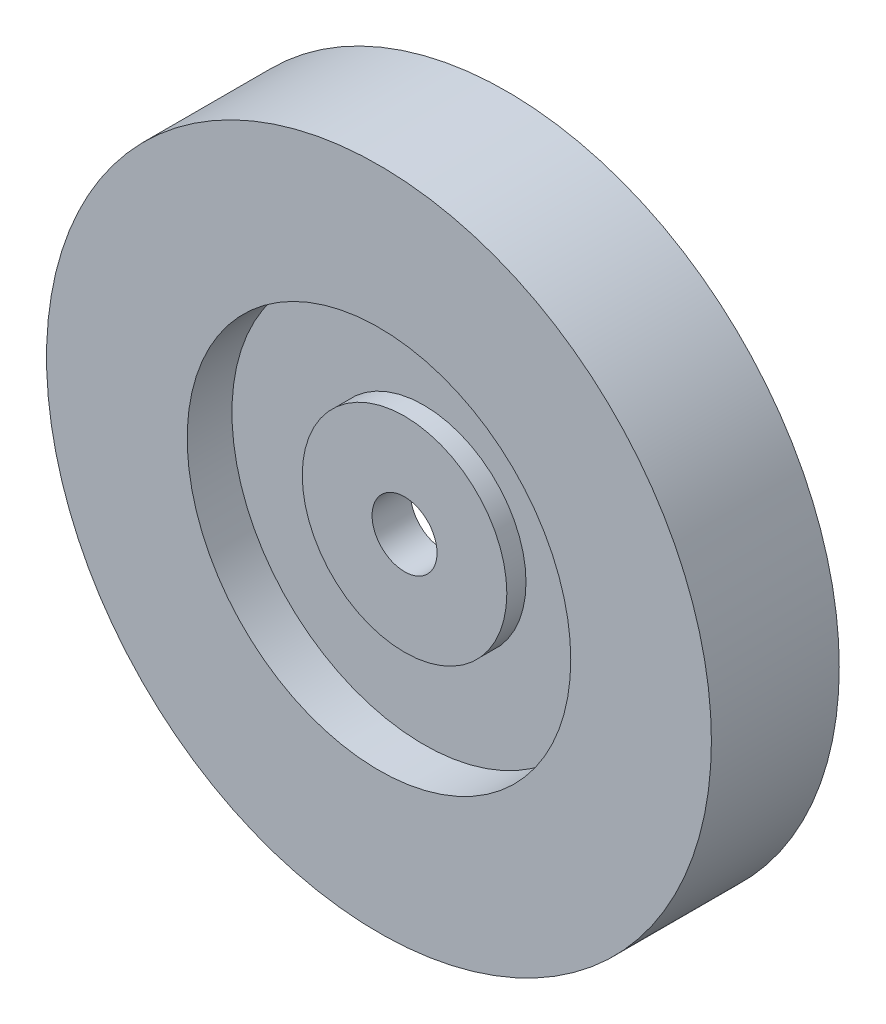
ISO-10303-21;
HEADER;
FILE_DESCRIPTION(('STEP AP214'),'2;1');
FILE_NAME('part.step','',(''),(''),'','','');
FILE_SCHEMA(('AUTOMOTIVE_DESIGN { 1 0 10303 214 1 1 1 1 }'));
ENDSEC;
DATA;
#1=APPLICATION_CONTEXT('core data for automotive mechanical design processes');
#2=APPLICATION_PROTOCOL_DEFINITION('international standard','automotive_design',2000,#1);
#3=PRODUCT_CONTEXT('',#1,'mechanical');
#4=PRODUCT('Part','Part','',(#3));
#5=PRODUCT_RELATED_PRODUCT_CATEGORY('part','',(#4));
#6=PRODUCT_DEFINITION_FORMATION('','',#4);
#7=PRODUCT_DEFINITION_CONTEXT('part definition',#1,'design');
#8=PRODUCT_DEFINITION('design','',#6,#7);
#9=PRODUCT_DEFINITION_SHAPE('','',#8);
#10=(LENGTH_UNIT() NAMED_UNIT(*) SI_UNIT(.MILLI.,.METRE.));
#11=(NAMED_UNIT(*) PLANE_ANGLE_UNIT() SI_UNIT($,.RADIAN.));
#12=(NAMED_UNIT(*) SI_UNIT($,.STERADIAN.) SOLID_ANGLE_UNIT());
#13=UNCERTAINTY_MEASURE_WITH_UNIT(LENGTH_MEASURE(1.E-05),#10,'distance_accuracy_value','');
#14=(GEOMETRIC_REPRESENTATION_CONTEXT(3) GLOBAL_UNCERTAINTY_ASSIGNED_CONTEXT((#13)) GLOBAL_UNIT_ASSIGNED_CONTEXT((#10,
#11,#12)) REPRESENTATION_CONTEXT('',''));
#15=CARTESIAN_POINT('',(0.,0.,0.));
#16=DIRECTION('',(0.,0.,1.));
#17=DIRECTION('',(1.,0.,0.));
#18=AXIS2_PLACEMENT_3D('',#15,#16,#17);
#19=CARTESIAN_POINT('',(0.,0.,15.));
#20=DIRECTION('',(0.,0.,-1.));
#21=DIRECTION('',(-1.,0.,0.));
#22=AXIS2_PLACEMENT_3D('',#19,#20,#21);
#23=CYLINDRICAL_SURFACE('',#22,80.);
#24=CARTESIAN_POINT('',(0.,0.,-15.));
#25=DIRECTION('',(0.,0.,1.));
#26=DIRECTION('',(1.,0.,0.));
#27=AXIS2_PLACEMENT_3D('',#24,#25,#26);
#28=CIRCLE('',#27,80.);
#29=CARTESIAN_POINT('',(80.,0.,-15.));
#30=VERTEX_POINT('',#29);
#31=EDGE_CURVE('E127',#30,#30,#28,.T.);
#32=ORIENTED_EDGE('',*,*,#31,.F.);
#33=EDGE_LOOP('',(#32));
#34=FACE_BOUND('',#33,.T.);
#35=CARTESIAN_POINT('',(0.,0.,0.));
#36=DIRECTION('',(0.,0.,1.));
#37=DIRECTION('',(1.,0.,0.));
#38=AXIS2_PLACEMENT_3D('',#35,#36,#37);
#39=CIRCLE('',#38,80.);
#40=CARTESIAN_POINT('',(80.,0.,0.));
#41=VERTEX_POINT('',#40);
#42=EDGE_CURVE('E134',#41,#41,#39,.T.);
#43=ORIENTED_EDGE('',*,*,#42,.T.);
#44=EDGE_LOOP('',(#43));
#45=FACE_BOUND('',#44,.T.);
#46=ADVANCED_FACE('F39',(#34,#45),#23,.F.);
#47=CARTESIAN_POINT('',(0.,0.,50.));
#48=DIRECTION('',(0.,0.,-1.));
#49=DIRECTION('',(-1.,0.,0.));
#50=AXIS2_PLACEMENT_3D('',#47,#48,#49);
#51=CYLINDRICAL_SURFACE('',#50,150.);
#52=CARTESIAN_POINT('',(0.,0.,-50.));
#53=DIRECTION('',(0.,0.,1.));
#54=DIRECTION('',(1.,0.,0.));
#55=AXIS2_PLACEMENT_3D('',#52,#53,#54);
#56=CIRCLE('',#55,150.);
#57=CARTESIAN_POINT('',(150.,0.,-50.));
#58=VERTEX_POINT('',#57);
#59=EDGE_CURVE('E62',#58,#58,#56,.T.);
#60=ORIENTED_EDGE('',*,*,#59,.F.);
#61=EDGE_LOOP('',(#60));
#62=FACE_BOUND('',#61,.T.);
#63=CARTESIAN_POINT('',(0.,0.,-15.));
#64=DIRECTION('',(0.,0.,1.));
#65=DIRECTION('',(1.,0.,0.));
#66=AXIS2_PLACEMENT_3D('',#63,#64,#65);
#67=CIRCLE('',#66,150.);
#68=CARTESIAN_POINT('',(150.,0.,-15.));
#69=VERTEX_POINT('',#68);
#70=EDGE_CURVE('E132',#69,#69,#67,.T.);
#71=ORIENTED_EDGE('',*,*,#70,.T.);
#72=EDGE_LOOP('',(#71));
#73=FACE_BOUND('',#72,.T.);
#74=ADVANCED_FACE('F88',(#62,#73),#51,.F.);
#75=CARTESIAN_POINT('',(0.,0.,15.));
#76=DIRECTION('',(0.,0.,1.));
#77=DIRECTION('',(1.,0.,0.));
#78=AXIS2_PLACEMENT_3D('',#75,#76,#77);
#79=CIRCLE('',#78,150.);
#80=CARTESIAN_POINT('',(150.,0.,15.));
#81=VERTEX_POINT('',#80);
#82=EDGE_CURVE('E10',#81,#81,#79,.T.);
#83=ORIENTED_EDGE('',*,*,#82,.F.);
#84=EDGE_LOOP('',(#83));
#85=FACE_BOUND('',#84,.T.);
#86=CARTESIAN_POINT('',(0.,0.,50.));
#87=DIRECTION('',(0.,0.,1.));
#88=DIRECTION('',(1.,0.,0.));
#89=AXIS2_PLACEMENT_3D('',#86,#87,#88);
#90=CIRCLE('',#89,150.);
#91=CARTESIAN_POINT('',(150.,0.,50.));
#92=VERTEX_POINT('',#91);
#93=EDGE_CURVE('E52',#92,#92,#90,.T.);
#94=ORIENTED_EDGE('',*,*,#93,.T.);
#95=EDGE_LOOP('',(#94));
#96=FACE_BOUND('',#95,.T.);
#97=ADVANCED_FACE('F41',(#85,#96),#51,.F.);
#98=CARTESIAN_POINT('',(0.,0.,50.));
#99=DIRECTION('',(0.,0.,-1.));
#100=DIRECTION('',(-1.,0.,0.));
#101=AXIS2_PLACEMENT_3D('',#98,#99,#100);
#102=CYLINDRICAL_SURFACE('',#101,260.);
#103=CARTESIAN_POINT('',(0.,0.,50.));
#104=DIRECTION('',(0.,0.,1.));
#105=DIRECTION('',(1.,0.,0.));
#106=AXIS2_PLACEMENT_3D('',#103,#104,#105);
#107=CIRCLE('',#106,260.);
#108=CARTESIAN_POINT('',(260.,0.,50.));
#109=VERTEX_POINT('',#108);
#110=EDGE_CURVE('E47',#109,#109,#107,.T.);
#111=ORIENTED_EDGE('',*,*,#110,.F.);
#112=EDGE_LOOP('',(#111));
#113=FACE_BOUND('',#112,.T.);
#114=CARTESIAN_POINT('',(0.,0.,-50.));
#115=DIRECTION('',(0.,0.,1.));
#116=DIRECTION('',(1.,0.,0.));
#117=AXIS2_PLACEMENT_3D('',#114,#115,#116);
#118=CIRCLE('',#117,260.);
#119=CARTESIAN_POINT('',(260.,0.,-50.));
#120=VERTEX_POINT('',#119);
#121=EDGE_CURVE('E58',#120,#120,#118,.T.);
#122=ORIENTED_EDGE('',*,*,#121,.T.);
#123=EDGE_LOOP('',(#122));
#124=FACE_BOUND('',#123,.T.);
#125=ADVANCED_FACE('F70',(#113,#124),#102,.T.);
#126=CARTESIAN_POINT('',(0.,0.,50.));
#127=DIRECTION('',(0.,0.,1.));
#128=DIRECTION('',(1.,0.,0.));
#129=AXIS2_PLACEMENT_3D('',#126,#127,#128);
#130=PLANE('',#129);
#131=ORIENTED_EDGE('',*,*,#93,.F.);
#132=EDGE_LOOP('',(#131));
#133=FACE_BOUND('',#132,.T.);
#134=ORIENTED_EDGE('',*,*,#110,.T.);
#135=EDGE_LOOP('',(#134));
#136=FACE_BOUND('',#135,.T.);
#137=ADVANCED_FACE('F75',(#133,#136),#130,.T.);
#138=CARTESIAN_POINT('',(0.,0.,-50.));
#139=DIRECTION('',(0.,0.,1.));
#140=DIRECTION('',(1.,0.,0.));
#141=AXIS2_PLACEMENT_3D('',#138,#139,#140);
#142=PLANE('',#141);
#143=ORIENTED_EDGE('',*,*,#59,.T.);
#144=EDGE_LOOP('',(#143));
#145=FACE_BOUND('',#144,.T.);
#146=ORIENTED_EDGE('',*,*,#121,.F.);
#147=EDGE_LOOP('',(#146));
#148=FACE_BOUND('',#147,.T.);
#149=ADVANCED_FACE('F72',(#145,#148),#142,.F.);
#150=CARTESIAN_POINT('',(0.,0.,15.));
#151=DIRECTION('',(0.,0.,1.));
#152=DIRECTION('',(1.,0.,0.));
#153=AXIS2_PLACEMENT_3D('',#150,#151,#152);
#154=PLANE('',#153);
#155=CARTESIAN_POINT('',(0.,0.,15.));
#156=DIRECTION('',(0.,0.,1.));
#157=DIRECTION('',(1.,0.,0.));
#158=AXIS2_PLACEMENT_3D('',#155,#156,#157);
#159=CIRCLE('',#158,80.);
#160=CARTESIAN_POINT('',(80.,0.,15.));
#161=VERTEX_POINT('',#160);
#162=EDGE_CURVE('E65',#161,#161,#159,.T.);
#163=ORIENTED_EDGE('',*,*,#162,.F.);
#164=EDGE_LOOP('',(#163));
#165=FACE_BOUND('',#164,.T.);
#166=ORIENTED_EDGE('',*,*,#82,.T.);
#167=EDGE_LOOP('',(#166));
#168=FACE_BOUND('',#167,.T.);
#169=ADVANCED_FACE('F74',(#165,#168),#154,.T.);
#170=CARTESIAN_POINT('',(0.,0.,-15.));
#171=DIRECTION('',(0.,0.,1.));
#172=DIRECTION('',(1.,0.,0.));
#173=AXIS2_PLACEMENT_3D('',#170,#171,#172);
#174=PLANE('',#173);
#175=ORIENTED_EDGE('',*,*,#31,.T.);
#176=EDGE_LOOP('',(#175));
#177=FACE_BOUND('',#176,.T.);
#178=ORIENTED_EDGE('',*,*,#70,.F.);
#179=EDGE_LOOP('',(#178));
#180=FACE_BOUND('',#179,.T.);
#181=ADVANCED_FACE('F82',(#177,#180),#174,.F.);
#182=CARTESIAN_POINT('',(0.,0.,30.));
#183=DIRECTION('',(0.,0.,-1.));
#184=DIRECTION('',(-1.,0.,0.));
#185=AXIS2_PLACEMENT_3D('',#182,#183,#184);
#186=CYLINDRICAL_SURFACE('',#185,25.4);
#187=CARTESIAN_POINT('',(0.,0.,30.));
#188=DIRECTION('',(0.,0.,1.));
#189=DIRECTION('',(1.,0.,0.));
#190=AXIS2_PLACEMENT_3D('',#187,#188,#189);
#191=CIRCLE('',#190,25.4);
#192=CARTESIAN_POINT('',(25.4,0.,30.));
#193=VERTEX_POINT('',#192);
#194=EDGE_CURVE('E121',#193,#193,#191,.T.);
#195=ORIENTED_EDGE('',*,*,#194,.T.);
#196=EDGE_LOOP('',(#195));
#197=FACE_BOUND('',#196,.T.);
#198=CARTESIAN_POINT('',(0.,0.,0.));
#199=DIRECTION('',(0.,0.,1.));
#200=DIRECTION('',(1.,0.,0.));
#201=AXIS2_PLACEMENT_3D('',#198,#199,#200);
#202=CIRCLE('',#201,25.4);
#203=CARTESIAN_POINT('',(25.4,0.,0.));
#204=VERTEX_POINT('',#203);
#205=EDGE_CURVE('E137',#204,#204,#202,.T.);
#206=ORIENTED_EDGE('',*,*,#205,.F.);
#207=EDGE_LOOP('',(#206));
#208=FACE_BOUND('',#207,.T.);
#209=ADVANCED_FACE('F99',(#197,#208),#186,.F.);
#210=CARTESIAN_POINT('',(0.,0.,30.));
#211=DIRECTION('',(0.,0.,-1.));
#212=DIRECTION('',(-1.,0.,0.));
#213=AXIS2_PLACEMENT_3D('',#210,#211,#212);
#214=CYLINDRICAL_SURFACE('',#213,80.);
#215=ORIENTED_EDGE('',*,*,#162,.T.);
#216=EDGE_LOOP('',(#215));
#217=FACE_BOUND('',#216,.T.);
#218=CARTESIAN_POINT('',(0.,0.,30.));
#219=DIRECTION('',(0.,0.,1.));
#220=DIRECTION('',(1.,0.,0.));
#221=AXIS2_PLACEMENT_3D('',#218,#219,#220);
#222=CIRCLE('',#221,80.);
#223=CARTESIAN_POINT('',(80.,0.,30.));
#224=VERTEX_POINT('',#223);
#225=EDGE_CURVE('E124',#224,#224,#222,.T.);
#226=ORIENTED_EDGE('',*,*,#225,.F.);
#227=EDGE_LOOP('',(#226));
#228=FACE_BOUND('',#227,.T.);
#229=ADVANCED_FACE('F104',(#217,#228),#214,.T.);
#230=CARTESIAN_POINT('',(0.,0.,30.));
#231=DIRECTION('',(0.,0.,1.));
#232=DIRECTION('',(1.,0.,0.));
#233=AXIS2_PLACEMENT_3D('',#230,#231,#232);
#234=PLANE('',#233);
#235=ORIENTED_EDGE('',*,*,#194,.F.);
#236=EDGE_LOOP('',(#235));
#237=FACE_BOUND('',#236,.T.);
#238=ORIENTED_EDGE('',*,*,#225,.T.);
#239=EDGE_LOOP('',(#238));
#240=FACE_BOUND('',#239,.T.);
#241=ADVANCED_FACE('F108',(#237,#240),#234,.T.);
#242=CARTESIAN_POINT('',(0.,0.,0.));
#243=DIRECTION('',(0.,0.,1.));
#244=DIRECTION('',(1.,0.,0.));
#245=AXIS2_PLACEMENT_3D('',#242,#243,#244);
#246=PLANE('',#245);
#247=ORIENTED_EDGE('',*,*,#205,.T.);
#248=EDGE_LOOP('',(#247));
#249=FACE_BOUND('',#248,.T.);
#250=ORIENTED_EDGE('',*,*,#42,.F.);
#251=EDGE_LOOP('',(#250));
#252=FACE_BOUND('',#251,.T.);
#253=ADVANCED_FACE('F110',(#249,#252),#246,.F.);
#254=CLOSED_SHELL('',(#46,#74,#97,#125,#137,#149,#169,#181,#209,#229,#241,#253));
#255=MANIFOLD_SOLID_BREP('B2',#254);
#256=ADVANCED_BREP_SHAPE_REPRESENTATION('',(#18,#255),#14);
#257=SHAPE_DEFINITION_REPRESENTATION(#9,#256);
ENDSEC;
END-ISO-10303-21;
